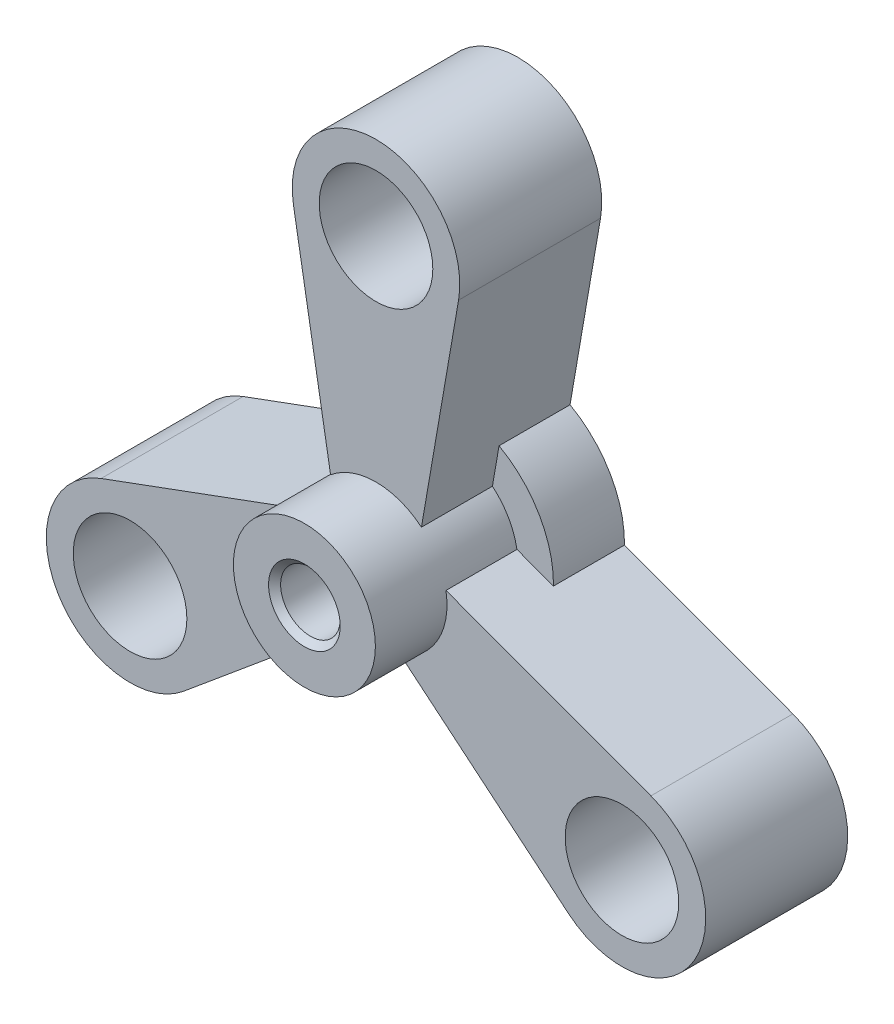
ISO-10303-21;
HEADER;
FILE_DESCRIPTION(('STEP AP214'),'2;1');
FILE_NAME('part.step','',(''),(''),'','','');
FILE_SCHEMA(('AUTOMOTIVE_DESIGN { 1 0 10303 214 1 1 1 1 }'));
ENDSEC;
DATA;
#1=APPLICATION_CONTEXT('core data for automotive mechanical design processes');
#2=APPLICATION_PROTOCOL_DEFINITION('international standard','automotive_design',2000,#1);
#3=PRODUCT_CONTEXT('',#1,'mechanical');
#4=PRODUCT('Part','Part','',(#3));
#5=PRODUCT_RELATED_PRODUCT_CATEGORY('part','',(#4));
#6=PRODUCT_DEFINITION_FORMATION('','',#4);
#7=PRODUCT_DEFINITION_CONTEXT('part definition',#1,'design');
#8=PRODUCT_DEFINITION('design','',#6,#7);
#9=PRODUCT_DEFINITION_SHAPE('','',#8);
#10=(LENGTH_UNIT() NAMED_UNIT(*) SI_UNIT(.MILLI.,.METRE.));
#11=(NAMED_UNIT(*) PLANE_ANGLE_UNIT() SI_UNIT($,.RADIAN.));
#12=(NAMED_UNIT(*) SI_UNIT($,.STERADIAN.) SOLID_ANGLE_UNIT());
#13=UNCERTAINTY_MEASURE_WITH_UNIT(LENGTH_MEASURE(1.E-05),#10,'distance_accuracy_value','');
#14=(GEOMETRIC_REPRESENTATION_CONTEXT(3) GLOBAL_UNCERTAINTY_ASSIGNED_CONTEXT((#13)) GLOBAL_UNIT_ASSIGNED_CONTEXT((#10,
#11,#12)) REPRESENTATION_CONTEXT('',''));
#15=CARTESIAN_POINT('',(0.,0.,0.));
#16=DIRECTION('',(0.,0.,1.));
#17=DIRECTION('',(1.,0.,0.));
#18=AXIS2_PLACEMENT_3D('',#15,#16,#17);
#19=CARTESIAN_POINT('',(0.,20.,5.));
#20=DIRECTION('',(0.,0.,-1.));
#21=DIRECTION('',(-1.,0.,0.));
#22=AXIS2_PLACEMENT_3D('',#19,#20,#21);
#23=CYLINDRICAL_SURFACE('',#22,4.);
#24=CARTESIAN_POINT('',(0.,20.,0.));
#25=DIRECTION('',(0.,0.,1.));
#26=DIRECTION('',(1.,0.,0.));
#27=AXIS2_PLACEMENT_3D('',#24,#25,#26);
#28=CIRCLE('',#27,4.);
#29=CARTESIAN_POINT('',(4.,20.,0.));
#30=VERTEX_POINT('',#29);
#31=EDGE_CURVE('E319',#30,#30,#28,.F.);
#32=ORIENTED_EDGE('',*,*,#31,.T.);
#33=EDGE_LOOP('',(#32));
#34=FACE_BOUND('',#33,.T.);
#35=CARTESIAN_POINT('',(0.,20.,10.));
#36=DIRECTION('',(0.,0.,1.));
#37=DIRECTION('',(1.,0.,0.));
#38=AXIS2_PLACEMENT_3D('',#35,#36,#37);
#39=CIRCLE('',#38,4.);
#40=CARTESIAN_POINT('',(4.,20.,10.));
#41=VERTEX_POINT('',#40);
#42=EDGE_CURVE('E309',#41,#41,#39,.F.);
#43=ORIENTED_EDGE('',*,*,#42,.F.);
#44=EDGE_LOOP('',(#43));
#45=FACE_BOUND('',#44,.T.);
#46=ADVANCED_FACE('F39',(#34,#45),#23,.F.);
#47=CARTESIAN_POINT('',(0.,20.,5.));
#48=DIRECTION('',(0.,0.,-1.));
#49=DIRECTION('',(-1.,0.,0.));
#50=AXIS2_PLACEMENT_3D('',#47,#48,#49);
#51=CYLINDRICAL_SURFACE('',#50,5.9);
#52=CARTESIAN_POINT('',(0.,20.,0.));
#53=DIRECTION('',(0.,0.,1.));
#54=DIRECTION('',(1.,0.,0.));
#55=AXIS2_PLACEMENT_3D('',#52,#53,#54);
#56=CIRCLE('',#55,5.9);
#57=CARTESIAN_POINT('',(-5.81411996780252,18.997,0.));
#58=VERTEX_POINT('',#57);
#59=CARTESIAN_POINT('',(5.81411996780252,18.997,0.));
#60=VERTEX_POINT('',#59);
#61=EDGE_CURVE('E327',#58,#60,#56,.F.);
#62=ORIENTED_EDGE('',*,*,#61,.F.);
#63=DIRECTION('',(0.,0.,-1.));
#64=VECTOR('',#63,1.);
#65=CARTESIAN_POINT('',(-5.81411996780252,18.997,5.));
#66=LINE('',#65,#64);
#67=CARTESIAN_POINT('',(-5.81411996780252,18.997,10.));
#68=VERTEX_POINT('',#67);
#69=EDGE_CURVE('E42',#68,#58,#66,.T.);
#70=ORIENTED_EDGE('',*,*,#69,.F.);
#71=CARTESIAN_POINT('',(0.,20.,10.));
#72=DIRECTION('',(0.,0.,1.));
#73=DIRECTION('',(1.,0.,0.));
#74=AXIS2_PLACEMENT_3D('',#71,#72,#73);
#75=CIRCLE('',#74,5.9);
#76=CARTESIAN_POINT('',(5.81411996780252,18.997,10.));
#77=VERTEX_POINT('',#76);
#78=EDGE_CURVE('E312',#77,#68,#75,.T.);
#79=ORIENTED_EDGE('',*,*,#78,.F.);
#80=DIRECTION('',(0.,0.,-1.));
#81=VECTOR('',#80,1.);
#82=CARTESIAN_POINT('',(5.81411996780252,18.997,5.));
#83=LINE('',#82,#81);
#84=EDGE_CURVE('E287',#77,#60,#83,.T.);
#85=ORIENTED_EDGE('',*,*,#84,.T.);
#86=EDGE_LOOP('',(#62,#70,#79,#85));
#87=FACE_BOUND('',#86,.T.);
#88=ADVANCED_FACE('F397',(#87),#51,.T.);
#89=CARTESIAN_POINT('',(-2.46361015584853,-0.425,5.));
#90=DIRECTION('',(0.98544406233941,0.17,0.));
#91=DIRECTION('',(-0.17,0.985444062339411,0.));
#92=AXIS2_PLACEMENT_3D('',#89,#90,#91);
#93=PLANE('',#92);
#94=DIRECTION('',(0.17,-0.985444062339411,0.));
#95=VECTOR('',#94,1.);
#96=CARTESIAN_POINT('',(-2.46361015584853,-0.425,0.));
#97=LINE('',#96,#95);
#98=CARTESIAN_POINT('',(-3.66569168386566,6.54314178960216,0.));
#99=VERTEX_POINT('',#98);
#100=EDGE_CURVE('E329',#58,#99,#97,.T.);
#101=ORIENTED_EDGE('',*,*,#100,.T.);
#102=DIRECTION('',(0.,0.,-1.));
#103=VECTOR('',#102,1.);
#104=CARTESIAN_POINT('',(-3.66569168386566,6.54314178960216,5.));
#105=LINE('',#104,#103);
#106=CARTESIAN_POINT('',(-3.66569168386566,6.54314178960216,5.));
#107=VERTEX_POINT('',#106);
#108=EDGE_CURVE('E323',#107,#99,#105,.T.);
#109=ORIENTED_EDGE('',*,*,#108,.F.);
#110=DIRECTION('',(0.17,-0.985444062339411,0.));
#111=VECTOR('',#110,1.);
#112=CARTESIAN_POINT('',(-2.46361015584853,-0.425,5.));
#113=LINE('',#112,#111);
#114=CARTESIAN_POINT('',(-3.1997317490653,3.84209795997233,5.));
#115=VERTEX_POINT('',#114);
#116=EDGE_CURVE('E11',#107,#115,#113,.T.);
#117=ORIENTED_EDGE('',*,*,#116,.T.);
#118=DIRECTION('',(0.,0.,-1.));
#119=VECTOR('',#118,1.);
#120=CARTESIAN_POINT('',(-3.1997317490653,3.84209795997233,10.));
#121=LINE('',#120,#119);
#122=CARTESIAN_POINT('',(-3.1997317490653,3.84209795997233,10.));
#123=VERTEX_POINT('',#122);
#124=EDGE_CURVE('E314',#123,#115,#121,.T.);
#125=ORIENTED_EDGE('',*,*,#124,.F.);
#126=DIRECTION('',(0.17,-0.985444062339411,0.));
#127=VECTOR('',#126,1.);
#128=CARTESIAN_POINT('',(-2.46361015584853,-0.425,10.));
#129=LINE('',#128,#127);
#130=EDGE_CURVE('E72',#68,#123,#129,.T.);
#131=ORIENTED_EDGE('',*,*,#130,.F.);
#132=ORIENTED_EDGE('',*,*,#69,.T.);
#133=EDGE_LOOP('',(#101,#109,#117,#125,#131,#132));
#134=FACE_BOUND('',#133,.T.);
#135=ADVANCED_FACE('F335',(#134),#93,.F.);
#136=CARTESIAN_POINT('',(0.,0.,5.));
#137=DIRECTION('',(0.,0.,-1.));
#138=DIRECTION('',(-1.,0.,0.));
#139=AXIS2_PLACEMENT_3D('',#136,#137,#138);
#140=CYLINDRICAL_SURFACE('',#139,7.5);
#141=CARTESIAN_POINT('',(0.,0.,0.));
#142=DIRECTION('',(0.,0.,1.));
#143=DIRECTION('',(1.,0.,0.));
#144=AXIS2_PLACEMENT_3D('',#141,#142,#143);
#145=CIRCLE('',#144,7.5);
#146=CARTESIAN_POINT('',(-7.49937285229187,-0.096988774131996,0.));
#147=VERTEX_POINT('',#146);
#148=EDGE_CURVE('E324',#147,#99,#145,.F.);
#149=ORIENTED_EDGE('',*,*,#148,.F.);
#150=DIRECTION('',(0.,0.,-1.));
#151=VECTOR('',#150,1.);
#152=CARTESIAN_POINT('',(-7.49937285229187,-0.096988774131996,5.));
#153=LINE('',#152,#151);
#154=CARTESIAN_POINT('',(-7.49937285229187,-0.096988774131996,5.));
#155=VERTEX_POINT('',#154);
#156=EDGE_CURVE('E195',#155,#147,#153,.T.);
#157=ORIENTED_EDGE('',*,*,#156,.F.);
#158=CARTESIAN_POINT('',(0.,0.,5.));
#159=DIRECTION('',(0.,0.,1.));
#160=DIRECTION('',(1.,0.,0.));
#161=AXIS2_PLACEMENT_3D('',#158,#159,#160);
#162=CIRCLE('',#161,7.5);
#163=EDGE_CURVE('E320',#155,#107,#162,.F.);
#164=ORIENTED_EDGE('',*,*,#163,.T.);
#165=ORIENTED_EDGE('',*,*,#108,.T.);
#166=EDGE_LOOP('',(#149,#157,#164,#165));
#167=FACE_BOUND('',#166,.T.);
#168=ADVANCED_FACE('F333',(#167),#140,.T.);
#169=CARTESIAN_POINT('',(0.,0.,5.));
#170=DIRECTION('',(0.,0.,1.));
#171=DIRECTION('',(1.,0.,0.));
#172=AXIS2_PLACEMENT_3D('',#169,#170,#171);
#173=PLANE('',#172);
#174=CARTESIAN_POINT('',(0.,0.,5.));
#175=DIRECTION('',(0.,0.,1.));
#176=DIRECTION('',(1.,0.,0.));
#177=AXIS2_PLACEMENT_3D('',#174,#175,#176);
#178=CIRCLE('',#177,5.);
#179=CARTESIAN_POINT('',(-4.92722031169705,0.850000000000045,5.));
#180=VERTEX_POINT('',#179);
#181=EDGE_CURVE('E306',#115,#180,#178,.T.);
#182=ORIENTED_EDGE('',*,*,#181,.F.);
#183=ORIENTED_EDGE('',*,*,#116,.F.);
#184=ORIENTED_EDGE('',*,*,#163,.F.);
#185=DIRECTION('',(0.938419591994469,0.345497712526342,0.));
#186=VECTOR('',#185,1.);
#187=CARTESIAN_POINT('',(-0.863744281315854,2.34604897998617,5.));
#188=LINE('',#187,#186);
#189=EDGE_CURVE('E194',#155,#180,#188,.T.);
#190=ORIENTED_EDGE('',*,*,#189,.T.);
#191=EDGE_LOOP('',(#182,#183,#184,#190));
#192=FACE_BOUND('',#191,.T.);
#193=ADVANCED_FACE('F393',(#192),#173,.T.);
#194=CARTESIAN_POINT('',(0.,0.,0.));
#195=DIRECTION('',(0.,0.,1.));
#196=DIRECTION('',(1.,0.,0.));
#197=AXIS2_PLACEMENT_3D('',#194,#195,#196);
#198=PLANE('',#197);
#199=CARTESIAN_POINT('',(0.,0.,0.));
#200=DIRECTION('',(0.,0.,1.));
#201=DIRECTION('',(1.,0.,0.));
#202=AXIS2_PLACEMENT_3D('',#199,#200,#201);
#203=CIRCLE('',#202,2.525);
#204=CARTESIAN_POINT('',(2.525,0.,0.));
#205=VERTEX_POINT('',#204);
#206=EDGE_CURVE('E351',#205,#205,#203,.T.);
#207=ORIENTED_EDGE('',*,*,#206,.T.);
#208=EDGE_LOOP('',(#207));
#209=FACE_BOUND('',#208,.T.);
#210=ORIENTED_EDGE('',*,*,#31,.F.);
#211=EDGE_LOOP('',(#210));
#212=FACE_BOUND('',#211,.T.);
#213=DIRECTION('',(0.938419591994469,0.345497712526342,0.));
#214=VECTOR('',#213,1.);
#215=CARTESIAN_POINT('',(-0.863744281315855,2.34604897998617,0.));
#216=LINE('',#215,#214);
#217=CARTESIAN_POINT('',(-19.3589445795943,-4.46332440723247,0.));
#218=VERTEX_POINT('',#217);
#219=EDGE_CURVE('E193',#218,#147,#216,.T.);
#220=ORIENTED_EDGE('',*,*,#219,.T.);
#221=ORIENTED_EDGE('',*,*,#148,.T.);
#222=ORIENTED_EDGE('',*,*,#100,.F.);
#223=ORIENTED_EDGE('',*,*,#61,.T.);
#224=DIRECTION('',(-0.17,-0.985444062339411,0.));
#225=VECTOR('',#224,1.);
#226=CARTESIAN_POINT('',(2.46361015584853,-0.425,0.));
#227=LINE('',#226,#225);
#228=CARTESIAN_POINT('',(3.66569168386566,6.54314178960216,0.));
#229=VERTEX_POINT('',#228);
#230=EDGE_CURVE('E291',#60,#229,#227,.T.);
#231=ORIENTED_EDGE('',*,*,#230,.T.);
#232=CARTESIAN_POINT('',(0.,0.,0.));
#233=DIRECTION('',(0.,0.,-1.));
#234=DIRECTION('',(-1.,0.,0.));
#235=AXIS2_PLACEMENT_3D('',#232,#233,#234);
#236=CIRCLE('',#235,7.5);
#237=CARTESIAN_POINT('',(7.49937285229187,-0.0969887741321001,0.));
#238=VERTEX_POINT('',#237);
#239=EDGE_CURVE('E295',#238,#229,#236,.F.);
#240=ORIENTED_EDGE('',*,*,#239,.F.);
#241=DIRECTION('',(-0.938419591994464,0.345497712526355,0.));
#242=VECTOR('',#241,1.);
#243=CARTESIAN_POINT('',(0.863744281315887,2.34604897998616,0.));
#244=LINE('',#243,#242);
#245=CARTESIAN_POINT('',(19.3589445795942,-4.46332440723274,0.));
#246=VERTEX_POINT('',#245);
#247=EDGE_CURVE('E272',#246,#238,#244,.T.);
#248=ORIENTED_EDGE('',*,*,#247,.F.);
#249=CARTESIAN_POINT('',(17.3205080756887,-10.0000000000001,0.));
#250=DIRECTION('',(0.,0.,1.));
#251=DIRECTION('',(-0.500000000000004,-0.866025403784436,0.));
#252=AXIS2_PLACEMENT_3D('',#249,#250,#251);
#253=CIRCLE('',#252,5.9);
#254=CARTESIAN_POINT('',(13.5448246117917,-14.5336755927674,0.));
#255=VERTEX_POINT('',#254);
#256=EDGE_CURVE('E270',#246,#255,#253,.F.);
#257=ORIENTED_EDGE('',*,*,#256,.T.);
#258=DIRECTION('',(-0.768419591994463,0.639946349813064,0.));
#259=VECTOR('',#258,1.);
#260=CARTESIAN_POINT('',(-1.59986587453266,-1.92104897998616,0.));
#261=LINE('',#260,#259);
#262=CARTESIAN_POINT('',(3.83368116842619,-6.44615301547011,0.));
#263=VERTEX_POINT('',#262);
#264=EDGE_CURVE('E237',#255,#263,#261,.T.);
#265=ORIENTED_EDGE('',*,*,#264,.T.);
#266=CARTESIAN_POINT('',(0.,0.,0.));
#267=DIRECTION('',(0.,0.,-1.));
#268=DIRECTION('',(0.500000000000004,0.866025403784436,0.));
#269=AXIS2_PLACEMENT_3D('',#266,#267,#268);
#270=CIRCLE('',#269,7.5);
#271=CARTESIAN_POINT('',(-3.83368116842628,-6.44615301547006,0.));
#272=VERTEX_POINT('',#271);
#273=EDGE_CURVE('E241',#272,#263,#270,.F.);
#274=ORIENTED_EDGE('',*,*,#273,.F.);
#275=DIRECTION('',(0.768419591994471,0.639946349813053,0.));
#276=VECTOR('',#275,1.);
#277=CARTESIAN_POINT('',(1.59986587453263,-1.92104897998618,0.));
#278=LINE('',#277,#276);
#279=CARTESIAN_POINT('',(-13.5448246117919,-14.5336755927672,0.));
#280=VERTEX_POINT('',#279);
#281=EDGE_CURVE('E218',#280,#272,#278,.T.);
#282=ORIENTED_EDGE('',*,*,#281,.F.);
#283=CARTESIAN_POINT('',(-17.3205080756889,-9.99999999999984,0.));
#284=DIRECTION('',(0.,0.,1.));
#285=DIRECTION('',(-0.499999999999992,0.866025403784443,0.));
#286=AXIS2_PLACEMENT_3D('',#283,#284,#285);
#287=CIRCLE('',#286,5.9);
#288=EDGE_CURVE('E216',#280,#218,#287,.F.);
#289=ORIENTED_EDGE('',*,*,#288,.T.);
#290=EDGE_LOOP('',(#220,#221,#222,#223,#231,#240,#248,#257,#265,#274,#282,#289));
#291=FACE_BOUND('',#290,.T.);
#292=CARTESIAN_POINT('',(17.3205080756887,-10.0000000000001,0.));
#293=DIRECTION('',(0.,0.,1.));
#294=DIRECTION('',(-0.500000000000004,-0.866025403784436,0.));
#295=AXIS2_PLACEMENT_3D('',#292,#293,#294);
#296=CIRCLE('',#295,4.);
#297=CARTESIAN_POINT('',(15.3205080756887,-13.4641016151378,0.));
#298=VERTEX_POINT('',#297);
#299=EDGE_CURVE('E267',#298,#298,#296,.F.);
#300=ORIENTED_EDGE('',*,*,#299,.F.);
#301=EDGE_LOOP('',(#300));
#302=FACE_BOUND('',#301,.T.);
#303=CARTESIAN_POINT('',(-17.3205080756889,-9.99999999999984,0.));
#304=DIRECTION('',(0.,0.,1.));
#305=DIRECTION('',(-0.499999999999992,0.866025403784443,0.));
#306=AXIS2_PLACEMENT_3D('',#303,#304,#305);
#307=CIRCLE('',#306,4.);
#308=CARTESIAN_POINT('',(-19.3205080756888,-6.53589838486207,0.));
#309=VERTEX_POINT('',#308);
#310=EDGE_CURVE('E213',#309,#309,#307,.F.);
#311=ORIENTED_EDGE('',*,*,#310,.F.);
#312=EDGE_LOOP('',(#311));
#313=FACE_BOUND('',#312,.T.);
#314=ADVANCED_FACE('F338',(#209,#212,#291,#302,#313),#198,.F.);
#315=CARTESIAN_POINT('',(0.,0.,10.));
#316=DIRECTION('',(0.,0.,-1.));
#317=DIRECTION('',(-1.,0.,0.));
#318=AXIS2_PLACEMENT_3D('',#315,#316,#317);
#319=CYLINDRICAL_SURFACE('',#318,5.);
#320=ORIENTED_EDGE('',*,*,#181,.T.);
#321=DIRECTION('',(0.,0.,-1.));
#322=VECTOR('',#321,1.);
#323=CARTESIAN_POINT('',(-4.92722031169705,0.850000000000045,10.));
#324=LINE('',#323,#322);
#325=CARTESIAN_POINT('',(-4.92722031169705,0.850000000000045,10.));
#326=VERTEX_POINT('',#325);
#327=EDGE_CURVE('E186',#326,#180,#324,.T.);
#328=ORIENTED_EDGE('',*,*,#327,.F.);
#329=CARTESIAN_POINT('',(0.,0.,10.));
#330=DIRECTION('',(0.,0.,1.));
#331=DIRECTION('',(-0.499999999999992,0.866025403784443,0.));
#332=AXIS2_PLACEMENT_3D('',#329,#330,#331);
#333=CIRCLE('',#332,5.);
#334=CARTESIAN_POINT('',(-1.7274885626318,-4.69209795997231,10.));
#335=VERTEX_POINT('',#334);
#336=EDGE_CURVE('E182',#326,#335,#333,.T.);
#337=ORIENTED_EDGE('',*,*,#336,.T.);
#338=DIRECTION('',(0.,0.,-1.));
#339=VECTOR('',#338,1.);
#340=CARTESIAN_POINT('',(-1.7274885626318,-4.69209795997231,10.));
#341=LINE('',#340,#339);
#342=CARTESIAN_POINT('',(-1.7274885626318,-4.69209795997231,5.));
#343=VERTEX_POINT('',#342);
#344=EDGE_CURVE('E206',#335,#343,#341,.T.);
#345=ORIENTED_EDGE('',*,*,#344,.T.);
#346=CARTESIAN_POINT('',(0.,0.,5.));
#347=DIRECTION('',(0.,0.,-1.));
#348=DIRECTION('',(0.500000000000004,0.866025403784436,0.));
#349=AXIS2_PLACEMENT_3D('',#346,#347,#348);
#350=CIRCLE('',#349,5.);
#351=CARTESIAN_POINT('',(1.72748856263173,-4.69209795997234,5.));
#352=VERTEX_POINT('',#351);
#353=EDGE_CURVE('E210',#352,#343,#350,.T.);
#354=ORIENTED_EDGE('',*,*,#353,.F.);
#355=DIRECTION('',(0.,0.,-1.));
#356=VECTOR('',#355,1.);
#357=CARTESIAN_POINT('',(1.72748856263173,-4.69209795997234,10.));
#358=LINE('',#357,#356);
#359=CARTESIAN_POINT('',(1.72748856263173,-4.69209795997234,10.));
#360=VERTEX_POINT('',#359);
#361=EDGE_CURVE('E228',#360,#352,#358,.T.);
#362=ORIENTED_EDGE('',*,*,#361,.F.);
#363=CARTESIAN_POINT('',(0.,0.,10.));
#364=DIRECTION('',(0.,0.,1.));
#365=DIRECTION('',(-0.500000000000004,-0.866025403784436,0.));
#366=AXIS2_PLACEMENT_3D('',#363,#364,#365);
#367=CIRCLE('',#366,5.);
#368=CARTESIAN_POINT('',(4.92722031169706,0.849999999999977,10.));
#369=VERTEX_POINT('',#368);
#370=EDGE_CURVE('E232',#360,#369,#367,.T.);
#371=ORIENTED_EDGE('',*,*,#370,.T.);
#372=DIRECTION('',(0.,0.,-1.));
#373=VECTOR('',#372,1.);
#374=CARTESIAN_POINT('',(4.92722031169706,0.849999999999977,10.));
#375=LINE('',#374,#373);
#376=CARTESIAN_POINT('',(4.92722031169706,0.849999999999977,5.));
#377=VERTEX_POINT('',#376);
#378=EDGE_CURVE('E259',#369,#377,#375,.T.);
#379=ORIENTED_EDGE('',*,*,#378,.T.);
#380=CARTESIAN_POINT('',(0.,0.,5.));
#381=DIRECTION('',(0.,0.,-1.));
#382=DIRECTION('',(-1.,0.,0.));
#383=AXIS2_PLACEMENT_3D('',#380,#381,#382);
#384=CIRCLE('',#383,5.);
#385=CARTESIAN_POINT('',(3.1997317490653,3.84209795997233,5.));
#386=VERTEX_POINT('',#385);
#387=EDGE_CURVE('E263',#386,#377,#384,.T.);
#388=ORIENTED_EDGE('',*,*,#387,.F.);
#389=DIRECTION('',(0.,0.,-1.));
#390=VECTOR('',#389,1.);
#391=CARTESIAN_POINT('',(3.1997317490653,3.84209795997233,10.));
#392=LINE('',#391,#390);
#393=CARTESIAN_POINT('',(3.1997317490653,3.84209795997233,10.));
#394=VERTEX_POINT('',#393);
#395=EDGE_CURVE('E282',#394,#386,#392,.T.);
#396=ORIENTED_EDGE('',*,*,#395,.F.);
#397=CARTESIAN_POINT('',(0.,0.,10.));
#398=DIRECTION('',(0.,0.,1.));
#399=DIRECTION('',(1.,0.,0.));
#400=AXIS2_PLACEMENT_3D('',#397,#398,#399);
#401=CIRCLE('',#400,5.);
#402=EDGE_CURVE('E286',#394,#123,#401,.T.);
#403=ORIENTED_EDGE('',*,*,#402,.T.);
#404=ORIENTED_EDGE('',*,*,#124,.T.);
#405=EDGE_LOOP('',(#320,#328,#337,#345,#354,#362,#371,#379,#388,#396,#403,#404));
#406=FACE_BOUND('',#405,.T.);
#407=CARTESIAN_POINT('',(0.,0.,15.0436088075099));
#408=DIRECTION('',(0.,0.,1.));
#409=DIRECTION('',(1.,0.,0.));
#410=AXIS2_PLACEMENT_3D('',#407,#408,#409);
#411=CIRCLE('',#410,5.);
#412=CARTESIAN_POINT('',(5.,0.,15.0436088075099));
#413=VERTEX_POINT('',#412);
#414=EDGE_CURVE('E303',#413,#413,#411,.T.);
#415=ORIENTED_EDGE('',*,*,#414,.F.);
#416=EDGE_LOOP('',(#415));
#417=FACE_BOUND('',#416,.T.);
#418=ADVANCED_FACE('F383',(#406,#417),#319,.T.);
#419=CARTESIAN_POINT('',(0.,0.,10.));
#420=DIRECTION('',(0.,0.,1.));
#421=DIRECTION('',(1.,0.,0.));
#422=AXIS2_PLACEMENT_3D('',#419,#420,#421);
#423=PLANE('',#422);
#424=ORIENTED_EDGE('',*,*,#42,.T.);
#425=EDGE_LOOP('',(#424));
#426=FACE_BOUND('',#425,.T.);
#427=ORIENTED_EDGE('',*,*,#402,.F.);
#428=DIRECTION('',(-0.17,-0.985444062339411,0.));
#429=VECTOR('',#428,1.);
#430=CARTESIAN_POINT('',(2.46361015584853,-0.425,10.));
#431=LINE('',#430,#429);
#432=EDGE_CURVE('E279',#77,#394,#431,.T.);
#433=ORIENTED_EDGE('',*,*,#432,.F.);
#434=ORIENTED_EDGE('',*,*,#78,.T.);
#435=ORIENTED_EDGE('',*,*,#130,.T.);
#436=EDGE_LOOP('',(#427,#433,#434,#435));
#437=FACE_BOUND('',#436,.T.);
#438=ADVANCED_FACE('F379',(#426,#437),#423,.T.);
#439=CARTESIAN_POINT('',(0.,0.,15.0436088075099));
#440=DIRECTION('',(0.,0.,1.));
#441=DIRECTION('',(1.,0.,0.));
#442=AXIS2_PLACEMENT_3D('',#439,#440,#441);
#443=PLANE('',#442);
#444=CARTESIAN_POINT('',(0.,0.,15.0436088075099));
#445=DIRECTION('',(0.,0.,1.));
#446=DIRECTION('',(1.,0.,0.));
#447=AXIS2_PLACEMENT_3D('',#444,#445,#446);
#448=CIRCLE('',#447,2.525);
#449=CARTESIAN_POINT('',(2.525,0.,15.0436088075099));
#450=VERTEX_POINT('',#449);
#451=EDGE_CURVE('E348',#450,#450,#448,.T.);
#452=ORIENTED_EDGE('',*,*,#451,.F.);
#453=EDGE_LOOP('',(#452));
#454=FACE_BOUND('',#453,.T.);
#455=ORIENTED_EDGE('',*,*,#414,.T.);
#456=EDGE_LOOP('',(#455));
#457=FACE_BOUND('',#456,.T.);
#458=ADVANCED_FACE('F375',(#454,#457),#443,.T.);
#459=CARTESIAN_POINT('',(2.46361015584853,-0.425,5.));
#460=DIRECTION('',(-0.98544406233941,0.17,0.));
#461=DIRECTION('',(0.17,0.985444062339411,0.));
#462=AXIS2_PLACEMENT_3D('',#459,#460,#461);
#463=PLANE('',#462);
#464=ORIENTED_EDGE('',*,*,#230,.F.);
#465=ORIENTED_EDGE('',*,*,#84,.F.);
#466=ORIENTED_EDGE('',*,*,#432,.T.);
#467=ORIENTED_EDGE('',*,*,#395,.T.);
#468=DIRECTION('',(-0.17,-0.985444062339411,0.));
#469=VECTOR('',#468,1.);
#470=CARTESIAN_POINT('',(2.46361015584853,-0.425,5.));
#471=LINE('',#470,#469);
#472=CARTESIAN_POINT('',(3.66569168386566,6.54314178960216,5.));
#473=VERTEX_POINT('',#472);
#474=EDGE_CURVE('E283',#473,#386,#471,.T.);
#475=ORIENTED_EDGE('',*,*,#474,.F.);
#476=DIRECTION('',(0.,0.,-1.));
#477=VECTOR('',#476,1.);
#478=CARTESIAN_POINT('',(3.66569168386566,6.54314178960216,5.));
#479=LINE('',#478,#477);
#480=EDGE_CURVE('E294',#473,#229,#479,.T.);
#481=ORIENTED_EDGE('',*,*,#480,.T.);
#482=EDGE_LOOP('',(#464,#465,#466,#467,#475,#481));
#483=FACE_BOUND('',#482,.T.);
#484=ADVANCED_FACE('F378',(#483),#463,.F.);
#485=CARTESIAN_POINT('',(0.,0.,5.));
#486=DIRECTION('',(0.,0.,-1.));
#487=DIRECTION('',(1.,0.,0.));
#488=AXIS2_PLACEMENT_3D('',#485,#486,#487);
#489=CYLINDRICAL_SURFACE('',#488,7.5);
#490=ORIENTED_EDGE('',*,*,#239,.T.);
#491=ORIENTED_EDGE('',*,*,#480,.F.);
#492=CARTESIAN_POINT('',(0.,0.,5.));
#493=DIRECTION('',(0.,0.,-1.));
#494=DIRECTION('',(-1.,0.,0.));
#495=AXIS2_PLACEMENT_3D('',#492,#493,#494);
#496=CIRCLE('',#495,7.5);
#497=CARTESIAN_POINT('',(7.49937285229187,-0.0969887741321001,5.));
#498=VERTEX_POINT('',#497);
#499=EDGE_CURVE('E292',#498,#473,#496,.F.);
#500=ORIENTED_EDGE('',*,*,#499,.F.);
#501=DIRECTION('',(0.,0.,-1.));
#502=VECTOR('',#501,1.);
#503=CARTESIAN_POINT('',(7.49937285229187,-0.0969887741321001,5.));
#504=LINE('',#503,#502);
#505=EDGE_CURVE('E275',#498,#238,#504,.T.);
#506=ORIENTED_EDGE('',*,*,#505,.T.);
#507=EDGE_LOOP('',(#490,#491,#500,#506));
#508=FACE_BOUND('',#507,.T.);
#509=ADVANCED_FACE('F442',(#508),#489,.T.);
#510=CARTESIAN_POINT('',(0.,0.,5.));
#511=DIRECTION('',(0.,0.,1.));
#512=DIRECTION('',(-1.,0.,0.));
#513=AXIS2_PLACEMENT_3D('',#510,#511,#512);
#514=PLANE('',#513);
#515=ORIENTED_EDGE('',*,*,#387,.T.);
#516=DIRECTION('',(-0.938419591994464,0.345497712526355,0.));
#517=VECTOR('',#516,1.);
#518=CARTESIAN_POINT('',(0.863744281315887,2.34604897998616,5.));
#519=LINE('',#518,#517);
#520=EDGE_CURVE('E260',#498,#377,#519,.T.);
#521=ORIENTED_EDGE('',*,*,#520,.F.);
#522=ORIENTED_EDGE('',*,*,#499,.T.);
#523=ORIENTED_EDGE('',*,*,#474,.T.);
#524=EDGE_LOOP('',(#515,#521,#522,#523));
#525=FACE_BOUND('',#524,.T.);
#526=ADVANCED_FACE('F437',(#525),#514,.T.);
#527=CARTESIAN_POINT('',(17.3205080756887,-10.0000000000001,5.));
#528=DIRECTION('',(0.,0.,-1.));
#529=DIRECTION('',(0.500000000000004,0.866025403784436,0.));
#530=AXIS2_PLACEMENT_3D('',#527,#528,#529);
#531=CYLINDRICAL_SURFACE('',#530,4.);
#532=ORIENTED_EDGE('',*,*,#299,.T.);
#533=EDGE_LOOP('',(#532));
#534=FACE_BOUND('',#533,.T.);
#535=CARTESIAN_POINT('',(17.3205080756887,-10.0000000000001,10.));
#536=DIRECTION('',(0.,0.,1.));
#537=DIRECTION('',(-0.500000000000004,-0.866025403784436,0.));
#538=AXIS2_PLACEMENT_3D('',#535,#536,#537);
#539=CIRCLE('',#538,4.);
#540=CARTESIAN_POINT('',(15.3205080756887,-13.4641016151378,10.));
#541=VERTEX_POINT('',#540);
#542=EDGE_CURVE('E251',#541,#541,#539,.F.);
#543=ORIENTED_EDGE('',*,*,#542,.F.);
#544=EDGE_LOOP('',(#543));
#545=FACE_BOUND('',#544,.T.);
#546=ADVANCED_FACE('F465',(#534,#545),#531,.F.);
#547=CARTESIAN_POINT('',(17.3205080756887,-10.0000000000001,5.));
#548=DIRECTION('',(0.,0.,-1.));
#549=DIRECTION('',(0.500000000000004,0.866025403784436,0.));
#550=AXIS2_PLACEMENT_3D('',#547,#548,#549);
#551=CYLINDRICAL_SURFACE('',#550,5.9);
#552=ORIENTED_EDGE('',*,*,#256,.F.);
#553=DIRECTION('',(0.,0.,-1.));
#554=VECTOR('',#553,1.);
#555=CARTESIAN_POINT('',(19.3589445795942,-4.46332440723274,5.));
#556=LINE('',#555,#554);
#557=CARTESIAN_POINT('',(19.3589445795942,-4.46332440723275,10.));
#558=VERTEX_POINT('',#557);
#559=EDGE_CURVE('E264',#558,#246,#556,.T.);
#560=ORIENTED_EDGE('',*,*,#559,.F.);
#561=CARTESIAN_POINT('',(17.3205080756887,-10.0000000000001,10.));
#562=DIRECTION('',(0.,0.,1.));
#563=DIRECTION('',(-0.500000000000004,-0.866025403784436,0.));
#564=AXIS2_PLACEMENT_3D('',#561,#562,#563);
#565=CIRCLE('',#564,5.9);
#566=CARTESIAN_POINT('',(13.5448246117917,-14.5336755927674,10.));
#567=VERTEX_POINT('',#566);
#568=EDGE_CURVE('E254',#567,#558,#565,.T.);
#569=ORIENTED_EDGE('',*,*,#568,.F.);
#570=DIRECTION('',(0.,0.,-1.));
#571=VECTOR('',#570,1.);
#572=CARTESIAN_POINT('',(13.5448246117917,-14.5336755927674,5.));
#573=LINE('',#572,#571);
#574=EDGE_CURVE('E233',#567,#255,#573,.T.);
#575=ORIENTED_EDGE('',*,*,#574,.T.);
#576=EDGE_LOOP('',(#552,#560,#569,#575));
#577=FACE_BOUND('',#576,.T.);
#578=ADVANCED_FACE('F444',(#577),#551,.T.);
#579=CARTESIAN_POINT('',(0.863744281315887,2.34604897998616,5.));
#580=DIRECTION('',(-0.345497712526355,-0.938419591994464,0.));
#581=DIRECTION('',(0.938419591994464,-0.345497712526355,0.));
#582=AXIS2_PLACEMENT_3D('',#579,#580,#581);
#583=PLANE('',#582);
#584=ORIENTED_EDGE('',*,*,#247,.T.);
#585=ORIENTED_EDGE('',*,*,#505,.F.);
#586=ORIENTED_EDGE('',*,*,#520,.T.);
#587=ORIENTED_EDGE('',*,*,#378,.F.);
#588=DIRECTION('',(-0.938419591994464,0.345497712526355,0.));
#589=VECTOR('',#588,1.);
#590=CARTESIAN_POINT('',(0.863744281315887,2.34604897998616,10.));
#591=LINE('',#590,#589);
#592=EDGE_CURVE('E257',#558,#369,#591,.T.);
#593=ORIENTED_EDGE('',*,*,#592,.F.);
#594=ORIENTED_EDGE('',*,*,#559,.T.);
#595=EDGE_LOOP('',(#584,#585,#586,#587,#593,#594));
#596=FACE_BOUND('',#595,.T.);
#597=ADVANCED_FACE('F433',(#596),#583,.F.);
#598=CARTESIAN_POINT('',(0.,0.,10.));
#599=DIRECTION('',(0.,0.,1.));
#600=DIRECTION('',(-0.500000000000004,-0.866025403784436,0.));
#601=AXIS2_PLACEMENT_3D('',#598,#599,#600);
#602=PLANE('',#601);
#603=ORIENTED_EDGE('',*,*,#542,.T.);
#604=EDGE_LOOP('',(#603));
#605=FACE_BOUND('',#604,.T.);
#606=ORIENTED_EDGE('',*,*,#370,.F.);
#607=DIRECTION('',(-0.768419591994463,0.639946349813064,0.));
#608=VECTOR('',#607,1.);
#609=CARTESIAN_POINT('',(-1.59986587453266,-1.92104897998616,10.));
#610=LINE('',#609,#608);
#611=EDGE_CURVE('E225',#567,#360,#610,.T.);
#612=ORIENTED_EDGE('',*,*,#611,.F.);
#613=ORIENTED_EDGE('',*,*,#568,.T.);
#614=ORIENTED_EDGE('',*,*,#592,.T.);
#615=EDGE_LOOP('',(#606,#612,#613,#614));
#616=FACE_BOUND('',#615,.T.);
#617=ADVANCED_FACE('F430',(#605,#616),#602,.T.);
#618=CARTESIAN_POINT('',(-1.59986587453266,-1.92104897998616,5.));
#619=DIRECTION('',(0.639946349813064,0.768419591994463,0.));
#620=DIRECTION('',(0.768419591994463,-0.639946349813064,0.));
#621=AXIS2_PLACEMENT_3D('',#618,#619,#620);
#622=PLANE('',#621);
#623=ORIENTED_EDGE('',*,*,#264,.F.);
#624=ORIENTED_EDGE('',*,*,#574,.F.);
#625=ORIENTED_EDGE('',*,*,#611,.T.);
#626=ORIENTED_EDGE('',*,*,#361,.T.);
#627=DIRECTION('',(-0.768419591994463,0.639946349813064,0.));
#628=VECTOR('',#627,1.);
#629=CARTESIAN_POINT('',(-1.59986587453266,-1.92104897998616,5.));
#630=LINE('',#629,#628);
#631=CARTESIAN_POINT('',(3.83368116842619,-6.44615301547011,5.));
#632=VERTEX_POINT('',#631);
#633=EDGE_CURVE('E229',#632,#352,#630,.T.);
#634=ORIENTED_EDGE('',*,*,#633,.F.);
#635=DIRECTION('',(0.,0.,-1.));
#636=VECTOR('',#635,1.);
#637=CARTESIAN_POINT('',(3.83368116842619,-6.44615301547011,5.));
#638=LINE('',#637,#636);
#639=EDGE_CURVE('E240',#632,#263,#638,.T.);
#640=ORIENTED_EDGE('',*,*,#639,.T.);
#641=EDGE_LOOP('',(#623,#624,#625,#626,#634,#640));
#642=FACE_BOUND('',#641,.T.);
#643=ADVANCED_FACE('F425',(#642),#622,.F.);
#644=CARTESIAN_POINT('',(0.,0.,5.));
#645=DIRECTION('',(0.,0.,-1.));
#646=DIRECTION('',(-0.500000000000004,-0.866025403784436,0.));
#647=AXIS2_PLACEMENT_3D('',#644,#645,#646);
#648=CYLINDRICAL_SURFACE('',#647,7.5);
#649=ORIENTED_EDGE('',*,*,#273,.T.);
#650=ORIENTED_EDGE('',*,*,#639,.F.);
#651=CARTESIAN_POINT('',(0.,0.,5.));
#652=DIRECTION('',(0.,0.,-1.));
#653=DIRECTION('',(0.500000000000004,0.866025403784436,0.));
#654=AXIS2_PLACEMENT_3D('',#651,#652,#653);
#655=CIRCLE('',#654,7.5);
#656=CARTESIAN_POINT('',(-3.83368116842628,-6.44615301547006,5.));
#657=VERTEX_POINT('',#656);
#658=EDGE_CURVE('E238',#657,#632,#655,.F.);
#659=ORIENTED_EDGE('',*,*,#658,.F.);
#660=DIRECTION('',(0.,0.,-1.));
#661=VECTOR('',#660,1.);
#662=CARTESIAN_POINT('',(-3.83368116842628,-6.44615301547006,5.));
#663=LINE('',#662,#661);
#664=EDGE_CURVE('E221',#657,#272,#663,.T.);
#665=ORIENTED_EDGE('',*,*,#664,.T.);
#666=EDGE_LOOP('',(#649,#650,#659,#665));
#667=FACE_BOUND('',#666,.T.);
#668=ADVANCED_FACE('F446',(#667),#648,.T.);
#669=CARTESIAN_POINT('',(0.,0.,5.));
#670=DIRECTION('',(0.,0.,1.));
#671=DIRECTION('',(0.500000000000004,0.866025403784436,0.));
#672=AXIS2_PLACEMENT_3D('',#669,#670,#671);
#673=PLANE('',#672);
#674=ORIENTED_EDGE('',*,*,#353,.T.);
#675=DIRECTION('',(0.768419591994471,0.639946349813053,0.));
#676=VECTOR('',#675,1.);
#677=CARTESIAN_POINT('',(1.59986587453263,-1.92104897998618,5.));
#678=LINE('',#677,#676);
#679=EDGE_CURVE('E207',#657,#343,#678,.T.);
#680=ORIENTED_EDGE('',*,*,#679,.F.);
#681=ORIENTED_EDGE('',*,*,#658,.T.);
#682=ORIENTED_EDGE('',*,*,#633,.T.);
#683=EDGE_LOOP('',(#674,#680,#681,#682));
#684=FACE_BOUND('',#683,.T.);
#685=ADVANCED_FACE('F420',(#684),#673,.T.);
#686=CARTESIAN_POINT('',(-17.3205080756889,-9.99999999999984,5.));
#687=DIRECTION('',(0.,0.,-1.));
#688=DIRECTION('',(0.499999999999992,-0.866025403784443,0.));
#689=AXIS2_PLACEMENT_3D('',#686,#687,#688);
#690=CYLINDRICAL_SURFACE('',#689,4.);
#691=ORIENTED_EDGE('',*,*,#310,.T.);
#692=EDGE_LOOP('',(#691));
#693=FACE_BOUND('',#692,.T.);
#694=CARTESIAN_POINT('',(-17.3205080756889,-9.99999999999984,10.));
#695=DIRECTION('',(0.,0.,1.));
#696=DIRECTION('',(-0.499999999999992,0.866025403784443,0.));
#697=AXIS2_PLACEMENT_3D('',#694,#695,#696);
#698=CIRCLE('',#697,4.);
#699=CARTESIAN_POINT('',(-19.3205080756888,-6.53589838486207,10.));
#700=VERTEX_POINT('',#699);
#701=EDGE_CURVE('E176',#700,#700,#698,.F.);
#702=ORIENTED_EDGE('',*,*,#701,.F.);
#703=EDGE_LOOP('',(#702));
#704=FACE_BOUND('',#703,.T.);
#705=ADVANCED_FACE('F453',(#693,#704),#690,.F.);
#706=CARTESIAN_POINT('',(-17.3205080756889,-9.99999999999984,5.));
#707=DIRECTION('',(0.,0.,-1.));
#708=DIRECTION('',(0.499999999999992,-0.866025403784443,0.));
#709=AXIS2_PLACEMENT_3D('',#706,#707,#708);
#710=CYLINDRICAL_SURFACE('',#709,5.9);
#711=ORIENTED_EDGE('',*,*,#288,.F.);
#712=DIRECTION('',(0.,0.,-1.));
#713=VECTOR('',#712,1.);
#714=CARTESIAN_POINT('',(-13.5448246117919,-14.5336755927672,5.));
#715=LINE('',#714,#713);
#716=CARTESIAN_POINT('',(-13.5448246117919,-14.5336755927672,10.));
#717=VERTEX_POINT('',#716);
#718=EDGE_CURVE('E172',#717,#280,#715,.T.);
#719=ORIENTED_EDGE('',*,*,#718,.F.);
#720=CARTESIAN_POINT('',(-17.3205080756889,-9.99999999999984,10.));
#721=DIRECTION('',(0.,0.,1.));
#722=DIRECTION('',(-0.499999999999992,0.866025403784443,0.));
#723=AXIS2_PLACEMENT_3D('',#720,#721,#722);
#724=CIRCLE('',#723,5.9);
#725=CARTESIAN_POINT('',(-19.3589445795943,-4.46332440723248,10.));
#726=VERTEX_POINT('',#725);
#727=EDGE_CURVE('E166',#726,#717,#724,.T.);
#728=ORIENTED_EDGE('',*,*,#727,.F.);
#729=DIRECTION('',(0.,0.,-1.));
#730=VECTOR('',#729,1.);
#731=CARTESIAN_POINT('',(-19.3589445795943,-4.46332440723247,5.));
#732=LINE('',#731,#730);
#733=EDGE_CURVE('E171',#726,#218,#732,.T.);
#734=ORIENTED_EDGE('',*,*,#733,.T.);
#735=EDGE_LOOP('',(#711,#719,#728,#734));
#736=FACE_BOUND('',#735,.T.);
#737=ADVANCED_FACE('F169',(#736),#710,.T.);
#738=CARTESIAN_POINT('',(1.59986587453263,-1.92104897998618,5.));
#739=DIRECTION('',(-0.639946349813053,0.768419591994471,0.));
#740=DIRECTION('',(-0.768419591994471,-0.639946349813053,0.));
#741=AXIS2_PLACEMENT_3D('',#738,#739,#740);
#742=PLANE('',#741);
#743=ORIENTED_EDGE('',*,*,#281,.T.);
#744=ORIENTED_EDGE('',*,*,#664,.F.);
#745=ORIENTED_EDGE('',*,*,#679,.T.);
#746=ORIENTED_EDGE('',*,*,#344,.F.);
#747=DIRECTION('',(0.768419591994471,0.639946349813053,0.));
#748=VECTOR('',#747,1.);
#749=CARTESIAN_POINT('',(1.59986587453263,-1.92104897998618,10.));
#750=LINE('',#749,#748);
#751=EDGE_CURVE('E175',#717,#335,#750,.T.);
#752=ORIENTED_EDGE('',*,*,#751,.F.);
#753=ORIENTED_EDGE('',*,*,#718,.T.);
#754=EDGE_LOOP('',(#743,#744,#745,#746,#752,#753));
#755=FACE_BOUND('',#754,.T.);
#756=ADVANCED_FACE('F416',(#755),#742,.F.);
#757=CARTESIAN_POINT('',(0.,0.,10.));
#758=DIRECTION('',(0.,0.,1.));
#759=DIRECTION('',(-0.499999999999992,0.866025403784443,0.));
#760=AXIS2_PLACEMENT_3D('',#757,#758,#759);
#761=PLANE('',#760);
#762=ORIENTED_EDGE('',*,*,#701,.T.);
#763=EDGE_LOOP('',(#762));
#764=FACE_BOUND('',#763,.T.);
#765=ORIENTED_EDGE('',*,*,#336,.F.);
#766=DIRECTION('',(0.938419591994469,0.345497712526342,0.));
#767=VECTOR('',#766,1.);
#768=CARTESIAN_POINT('',(-0.863744281315854,2.34604897998617,10.));
#769=LINE('',#768,#767);
#770=EDGE_CURVE('E179',#726,#326,#769,.T.);
#771=ORIENTED_EDGE('',*,*,#770,.F.);
#772=ORIENTED_EDGE('',*,*,#727,.T.);
#773=ORIENTED_EDGE('',*,*,#751,.T.);
#774=EDGE_LOOP('',(#765,#771,#772,#773));
#775=FACE_BOUND('',#774,.T.);
#776=ADVANCED_FACE('F180',(#764,#775),#761,.T.);
#777=CARTESIAN_POINT('',(-0.863744281315855,2.34604897998617,5.));
#778=DIRECTION('',(0.345497712526342,-0.938419591994469,0.));
#779=DIRECTION('',(-0.938419591994469,-0.345497712526342,0.));
#780=AXIS2_PLACEMENT_3D('',#777,#778,#779);
#781=PLANE('',#780);
#782=ORIENTED_EDGE('',*,*,#219,.F.);
#783=ORIENTED_EDGE('',*,*,#733,.F.);
#784=ORIENTED_EDGE('',*,*,#770,.T.);
#785=ORIENTED_EDGE('',*,*,#327,.T.);
#786=ORIENTED_EDGE('',*,*,#189,.F.);
#787=ORIENTED_EDGE('',*,*,#156,.T.);
#788=EDGE_LOOP('',(#782,#783,#784,#785,#786,#787));
#789=FACE_BOUND('',#788,.T.);
#790=ADVANCED_FACE('F190',(#789),#781,.F.);
#791=CARTESIAN_POINT('',(0.,0.,0.425000000000002));
#792=DIRECTION('',(0.,0.,-1.));
#793=DIRECTION('',(-1.,0.,0.));
#794=AXIS2_PLACEMENT_3D('',#791,#792,#793);
#795=CONICAL_SURFACE('',#794,2.1,0.785398163397448);
#796=ORIENTED_EDGE('',*,*,#206,.F.);
#797=EDGE_LOOP('',(#796));
#798=FACE_BOUND('',#797,.T.);
#799=CARTESIAN_POINT('',(0.,0.,0.425000000000002));
#800=DIRECTION('',(0.,0.,1.));
#801=DIRECTION('',(1.,0.,0.));
#802=AXIS2_PLACEMENT_3D('',#799,#800,#801);
#803=CIRCLE('',#802,2.1);
#804=CARTESIAN_POINT('',(2.1,0.,0.425000000000002));
#805=VERTEX_POINT('',#804);
#806=EDGE_CURVE('E187',#805,#805,#803,.T.);
#807=ORIENTED_EDGE('',*,*,#806,.T.);
#808=EDGE_LOOP('',(#807));
#809=FACE_BOUND('',#808,.T.);
#810=ADVANCED_FACE('F357',(#798,#809),#795,.F.);
#811=CARTESIAN_POINT('',(0.,0.,15.0436088075099));
#812=DIRECTION('',(0.,0.,1.));
#813=DIRECTION('',(1.,0.,0.));
#814=AXIS2_PLACEMENT_3D('',#811,#812,#813);
#815=CYLINDRICAL_SURFACE('',#814,2.1);
#816=ORIENTED_EDGE('',*,*,#806,.F.);
#817=EDGE_LOOP('',(#816));
#818=FACE_BOUND('',#817,.T.);
#819=CARTESIAN_POINT('',(0.,0.,14.6186088075099));
#820=DIRECTION('',(0.,0.,1.));
#821=DIRECTION('',(1.,0.,0.));
#822=AXIS2_PLACEMENT_3D('',#819,#820,#821);
#823=CIRCLE('',#822,2.1);
#824=CARTESIAN_POINT('',(2.1,0.,14.6186088075099));
#825=VERTEX_POINT('',#824);
#826=EDGE_CURVE('E345',#825,#825,#823,.T.);
#827=ORIENTED_EDGE('',*,*,#826,.T.);
#828=EDGE_LOOP('',(#827));
#829=FACE_BOUND('',#828,.T.);
#830=ADVANCED_FACE('F360',(#818,#829),#815,.F.);
#831=CARTESIAN_POINT('',(0.,0.,15.0436088075099));
#832=DIRECTION('',(0.,0.,1.));
#833=DIRECTION('',(1.,0.,0.));
#834=AXIS2_PLACEMENT_3D('',#831,#832,#833);
#835=CONICAL_SURFACE('',#834,2.525,0.785398163397452);
#836=ORIENTED_EDGE('',*,*,#826,.F.);
#837=EDGE_LOOP('',(#836));
#838=FACE_BOUND('',#837,.T.);
#839=ORIENTED_EDGE('',*,*,#451,.T.);
#840=EDGE_LOOP('',(#839));
#841=FACE_BOUND('',#840,.T.);
#842=ADVANCED_FACE('F366',(#838,#841),#835,.F.);
#843=CLOSED_SHELL('',(#46,#88,#135,#168,#193,#314,#418,#438,#458,#484,#509,#526,#546,#578,#597,
#617,#643,#668,#685,#705,#737,#756,#776,#790,#810,#830,#842));
#844=MANIFOLD_SOLID_BREP('B2',#843);
#845=ADVANCED_BREP_SHAPE_REPRESENTATION('',(#18,#844),#14);
#846=SHAPE_DEFINITION_REPRESENTATION(#9,#845);
ENDSEC;
END-ISO-10303-21;
